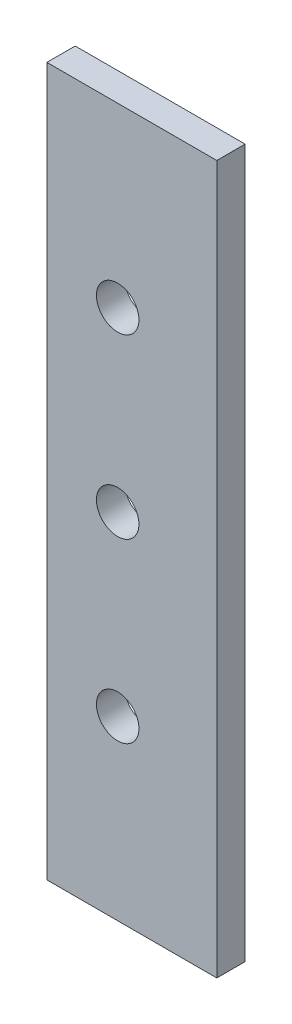
ISO-10303-21;
HEADER;
FILE_DESCRIPTION(('STEP AP214'),'2;1');
FILE_NAME('part.step','',(''),(''),'','','');
FILE_SCHEMA(('AUTOMOTIVE_DESIGN { 1 0 10303 214 1 1 1 1 }'));
ENDSEC;
DATA;
#1=APPLICATION_CONTEXT('core data for automotive mechanical design processes');
#2=APPLICATION_PROTOCOL_DEFINITION('international standard','automotive_design',2000,#1);
#3=PRODUCT_CONTEXT('',#1,'mechanical');
#4=PRODUCT('Part','Part','',(#3));
#5=PRODUCT_RELATED_PRODUCT_CATEGORY('part','',(#4));
#6=PRODUCT_DEFINITION_FORMATION('','',#4);
#7=PRODUCT_DEFINITION_CONTEXT('part definition',#1,'design');
#8=PRODUCT_DEFINITION('design','',#6,#7);
#9=PRODUCT_DEFINITION_SHAPE('','',#8);
#10=(LENGTH_UNIT() NAMED_UNIT(*) SI_UNIT(.MILLI.,.METRE.));
#11=(NAMED_UNIT(*) PLANE_ANGLE_UNIT() SI_UNIT($,.RADIAN.));
#12=(NAMED_UNIT(*) SI_UNIT($,.STERADIAN.) SOLID_ANGLE_UNIT());
#13=UNCERTAINTY_MEASURE_WITH_UNIT(LENGTH_MEASURE(1.E-05),#10,'distance_accuracy_value','');
#14=(GEOMETRIC_REPRESENTATION_CONTEXT(3) GLOBAL_UNCERTAINTY_ASSIGNED_CONTEXT((#13)) GLOBAL_UNIT_ASSIGNED_CONTEXT((#10,
#11,#12)) REPRESENTATION_CONTEXT('',''));
#15=CARTESIAN_POINT('',(0.,0.,0.));
#16=DIRECTION('',(0.,0.,1.));
#17=DIRECTION('',(1.,0.,0.));
#18=AXIS2_PLACEMENT_3D('',#15,#16,#17);
#19=CARTESIAN_POINT('',(-18.,75.,6.));
#20=DIRECTION('',(1.,0.,0.));
#21=DIRECTION('',(0.,1.,0.));
#22=AXIS2_PLACEMENT_3D('',#19,#20,#21);
#23=PLANE('',#22);
#24=DIRECTION('',(0.,-1.,0.));
#25=VECTOR('',#24,1.);
#26=CARTESIAN_POINT('',(-18.,75.,0.));
#27=LINE('',#26,#25);
#28=CARTESIAN_POINT('',(-18.,75.,0.));
#29=VERTEX_POINT('',#28);
#30=CARTESIAN_POINT('',(-18.,-75.,0.));
#31=VERTEX_POINT('',#30);
#32=EDGE_CURVE('E96',#29,#31,#27,.T.);
#33=ORIENTED_EDGE('',*,*,#32,.T.);
#34=DIRECTION('',(0.,0.,-1.));
#35=VECTOR('',#34,1.);
#36=CARTESIAN_POINT('',(-18.,-75.,6.));
#37=LINE('',#36,#35);
#38=CARTESIAN_POINT('',(-18.,-75.,6.));
#39=VERTEX_POINT('',#38);
#40=EDGE_CURVE('E11',#39,#31,#37,.T.);
#41=ORIENTED_EDGE('',*,*,#40,.F.);
#42=DIRECTION('',(0.,-1.,0.));
#43=VECTOR('',#42,1.);
#44=CARTESIAN_POINT('',(-18.,75.,6.));
#45=LINE('',#44,#43);
#46=CARTESIAN_POINT('',(-18.,75.,6.));
#47=VERTEX_POINT('',#46);
#48=EDGE_CURVE('E84',#47,#39,#45,.T.);
#49=ORIENTED_EDGE('',*,*,#48,.F.);
#50=DIRECTION('',(0.,0.,-1.));
#51=VECTOR('',#50,1.);
#52=CARTESIAN_POINT('',(-18.,75.,6.));
#53=LINE('',#52,#51);
#54=EDGE_CURVE('E92',#47,#29,#53,.T.);
#55=ORIENTED_EDGE('',*,*,#54,.T.);
#56=EDGE_LOOP('',(#33,#41,#49,#55));
#57=FACE_BOUND('',#56,.T.);
#58=ADVANCED_FACE('F33',(#57),#23,.F.);
#59=CARTESIAN_POINT('',(-18.,-75.,6.));
#60=DIRECTION('',(0.,1.,0.));
#61=DIRECTION('',(0.,0.,1.));
#62=AXIS2_PLACEMENT_3D('',#59,#60,#61);
#63=PLANE('',#62);
#64=DIRECTION('',(1.,0.,0.));
#65=VECTOR('',#64,1.);
#66=CARTESIAN_POINT('',(-18.,-75.,0.));
#67=LINE('',#66,#65);
#68=CARTESIAN_POINT('',(18.,-75.,0.));
#69=VERTEX_POINT('',#68);
#70=EDGE_CURVE('E88',#31,#69,#67,.T.);
#71=ORIENTED_EDGE('',*,*,#70,.T.);
#72=DIRECTION('',(0.,0.,-1.));
#73=VECTOR('',#72,1.);
#74=CARTESIAN_POINT('',(18.,-75.,6.));
#75=LINE('',#74,#73);
#76=CARTESIAN_POINT('',(18.,-75.,6.));
#77=VERTEX_POINT('',#76);
#78=EDGE_CURVE('E41',#77,#69,#75,.T.);
#79=ORIENTED_EDGE('',*,*,#78,.F.);
#80=DIRECTION('',(1.,0.,0.));
#81=VECTOR('',#80,1.);
#82=CARTESIAN_POINT('',(-18.,-75.,6.));
#83=LINE('',#82,#81);
#84=EDGE_CURVE('E79',#39,#77,#83,.T.);
#85=ORIENTED_EDGE('',*,*,#84,.F.);
#86=ORIENTED_EDGE('',*,*,#40,.T.);
#87=EDGE_LOOP('',(#71,#79,#85,#86));
#88=FACE_BOUND('',#87,.T.);
#89=ADVANCED_FACE('F87',(#88),#63,.F.);
#90=CARTESIAN_POINT('',(18.,75.,6.));
#91=DIRECTION('',(-1.,0.,0.));
#92=DIRECTION('',(0.,-1.,0.));
#93=AXIS2_PLACEMENT_3D('',#90,#91,#92);
#94=PLANE('',#93);
#95=DIRECTION('',(0.,1.,0.));
#96=VECTOR('',#95,1.);
#97=CARTESIAN_POINT('',(18.,75.,0.));
#98=LINE('',#97,#96);
#99=CARTESIAN_POINT('',(18.,75.,0.));
#100=VERTEX_POINT('',#99);
#101=EDGE_CURVE('E66',#69,#100,#98,.T.);
#102=ORIENTED_EDGE('',*,*,#101,.T.);
#103=DIRECTION('',(0.,0.,-1.));
#104=VECTOR('',#103,1.);
#105=CARTESIAN_POINT('',(18.,75.,6.));
#106=LINE('',#105,#104);
#107=CARTESIAN_POINT('',(18.,75.,6.));
#108=VERTEX_POINT('',#107);
#109=EDGE_CURVE('E89',#108,#100,#106,.T.);
#110=ORIENTED_EDGE('',*,*,#109,.F.);
#111=DIRECTION('',(0.,1.,0.));
#112=VECTOR('',#111,1.);
#113=CARTESIAN_POINT('',(18.,75.,6.));
#114=LINE('',#113,#112);
#115=EDGE_CURVE('E82',#77,#108,#114,.T.);
#116=ORIENTED_EDGE('',*,*,#115,.F.);
#117=ORIENTED_EDGE('',*,*,#78,.T.);
#118=EDGE_LOOP('',(#102,#110,#116,#117));
#119=FACE_BOUND('',#118,.T.);
#120=ADVANCED_FACE('F90',(#119),#94,.F.);
#121=CARTESIAN_POINT('',(-18.,75.,6.));
#122=DIRECTION('',(0.,-1.,0.));
#123=DIRECTION('',(0.,0.,-1.));
#124=AXIS2_PLACEMENT_3D('',#121,#122,#123);
#125=PLANE('',#124);
#126=DIRECTION('',(-1.,0.,0.));
#127=VECTOR('',#126,1.);
#128=CARTESIAN_POINT('',(-18.,75.,0.));
#129=LINE('',#128,#127);
#130=EDGE_CURVE('E72',#100,#29,#129,.T.);
#131=ORIENTED_EDGE('',*,*,#130,.T.);
#132=ORIENTED_EDGE('',*,*,#54,.F.);
#133=DIRECTION('',(-1.,0.,0.));
#134=VECTOR('',#133,1.);
#135=CARTESIAN_POINT('',(-18.,75.,6.));
#136=LINE('',#135,#134);
#137=EDGE_CURVE('E49',#108,#47,#136,.T.);
#138=ORIENTED_EDGE('',*,*,#137,.F.);
#139=ORIENTED_EDGE('',*,*,#109,.T.);
#140=EDGE_LOOP('',(#131,#132,#138,#139));
#141=FACE_BOUND('',#140,.T.);
#142=ADVANCED_FACE('F104',(#141),#125,.F.);
#143=CARTESIAN_POINT('',(0.,0.,6.));
#144=DIRECTION('',(0.,0.,1.));
#145=DIRECTION('',(1.,0.,0.));
#146=AXIS2_PLACEMENT_3D('',#143,#144,#145);
#147=PLANE('',#146);
#148=CARTESIAN_POINT('',(-3.00000000000001,37.5,6.));
#149=DIRECTION('',(0.,0.,1.));
#150=DIRECTION('',(1.,0.,0.));
#151=AXIS2_PLACEMENT_3D('',#148,#149,#150);
#152=CIRCLE('',#151,4.49999999999999);
#153=CARTESIAN_POINT('',(1.49999999999998,37.5,6.));
#154=VERTEX_POINT('',#153);
#155=EDGE_CURVE('E124',#154,#154,#152,.T.);
#156=ORIENTED_EDGE('',*,*,#155,.F.);
#157=EDGE_LOOP('',(#156));
#158=FACE_BOUND('',#157,.T.);
#159=CARTESIAN_POINT('',(-3.00000000000001,0.,6.));
#160=DIRECTION('',(0.,0.,1.));
#161=DIRECTION('',(1.,0.,0.));
#162=AXIS2_PLACEMENT_3D('',#159,#160,#161);
#163=CIRCLE('',#162,4.49999999999999);
#164=CARTESIAN_POINT('',(1.49999999999998,0.,6.));
#165=VERTEX_POINT('',#164);
#166=EDGE_CURVE('E118',#165,#165,#163,.T.);
#167=ORIENTED_EDGE('',*,*,#166,.F.);
#168=EDGE_LOOP('',(#167));
#169=FACE_BOUND('',#168,.T.);
#170=CARTESIAN_POINT('',(-3.00000000000001,-37.5,6.));
#171=DIRECTION('',(0.,0.,1.));
#172=DIRECTION('',(1.,0.,0.));
#173=AXIS2_PLACEMENT_3D('',#170,#171,#172);
#174=CIRCLE('',#173,4.49999999999999);
#175=CARTESIAN_POINT('',(1.49999999999998,-37.5,6.));
#176=VERTEX_POINT('',#175);
#177=EDGE_CURVE('E112',#176,#176,#174,.T.);
#178=ORIENTED_EDGE('',*,*,#177,.F.);
#179=EDGE_LOOP('',(#178));
#180=FACE_BOUND('',#179,.T.);
#181=ORIENTED_EDGE('',*,*,#48,.T.);
#182=ORIENTED_EDGE('',*,*,#84,.T.);
#183=ORIENTED_EDGE('',*,*,#115,.T.);
#184=ORIENTED_EDGE('',*,*,#137,.T.);
#185=EDGE_LOOP('',(#181,#182,#183,#184));
#186=FACE_BOUND('',#185,.T.);
#187=ADVANCED_FACE('F80',(#158,#169,#180,#186),#147,.T.);
#188=CARTESIAN_POINT('',(0.,0.,0.));
#189=DIRECTION('',(0.,0.,1.));
#190=DIRECTION('',(1.,0.,0.));
#191=AXIS2_PLACEMENT_3D('',#188,#189,#190);
#192=PLANE('',#191);
#193=CARTESIAN_POINT('',(-3.00000000000001,37.5,0.));
#194=DIRECTION('',(0.,0.,1.));
#195=DIRECTION('',(1.,0.,0.));
#196=AXIS2_PLACEMENT_3D('',#193,#194,#195);
#197=CIRCLE('',#196,4.5);
#198=CARTESIAN_POINT('',(1.49999999999999,37.5,0.));
#199=VERTEX_POINT('',#198);
#200=EDGE_CURVE('E121',#199,#199,#197,.T.);
#201=ORIENTED_EDGE('',*,*,#200,.T.);
#202=EDGE_LOOP('',(#201));
#203=FACE_BOUND('',#202,.T.);
#204=CARTESIAN_POINT('',(-3.00000000000001,0.,0.));
#205=DIRECTION('',(0.,0.,1.));
#206=DIRECTION('',(1.,0.,0.));
#207=AXIS2_PLACEMENT_3D('',#204,#205,#206);
#208=CIRCLE('',#207,4.5);
#209=CARTESIAN_POINT('',(1.49999999999999,0.,0.));
#210=VERTEX_POINT('',#209);
#211=EDGE_CURVE('E115',#210,#210,#208,.T.);
#212=ORIENTED_EDGE('',*,*,#211,.T.);
#213=EDGE_LOOP('',(#212));
#214=FACE_BOUND('',#213,.T.);
#215=CARTESIAN_POINT('',(-3.00000000000001,-37.5,0.));
#216=DIRECTION('',(0.,0.,1.));
#217=DIRECTION('',(1.,0.,0.));
#218=AXIS2_PLACEMENT_3D('',#215,#216,#217);
#219=CIRCLE('',#218,4.5);
#220=CARTESIAN_POINT('',(1.49999999999999,-37.5,0.));
#221=VERTEX_POINT('',#220);
#222=EDGE_CURVE('E99',#221,#221,#219,.T.);
#223=ORIENTED_EDGE('',*,*,#222,.T.);
#224=EDGE_LOOP('',(#223));
#225=FACE_BOUND('',#224,.T.);
#226=ORIENTED_EDGE('',*,*,#32,.F.);
#227=ORIENTED_EDGE('',*,*,#130,.F.);
#228=ORIENTED_EDGE('',*,*,#101,.F.);
#229=ORIENTED_EDGE('',*,*,#70,.F.);
#230=EDGE_LOOP('',(#226,#227,#228,#229));
#231=FACE_BOUND('',#230,.T.);
#232=ADVANCED_FACE('F107',(#203,#214,#225,#231),#192,.F.);
#233=CARTESIAN_POINT('',(-3.00000000000001,-37.5,6.));
#234=DIRECTION('',(0.,0.,1.));
#235=DIRECTION('',(1.,0.,0.));
#236=AXIS2_PLACEMENT_3D('',#233,#234,#235);
#237=CYLINDRICAL_SURFACE('',#236,4.49999999999999);
#238=ORIENTED_EDGE('',*,*,#222,.F.);
#239=EDGE_LOOP('',(#238));
#240=FACE_BOUND('',#239,.T.);
#241=ORIENTED_EDGE('',*,*,#177,.T.);
#242=EDGE_LOOP('',(#241));
#243=FACE_BOUND('',#242,.T.);
#244=ADVANCED_FACE('F137',(#240,#243),#237,.F.);
#245=CARTESIAN_POINT('',(-3.00000000000001,0.,6.));
#246=DIRECTION('',(0.,0.,1.));
#247=DIRECTION('',(1.,0.,0.));
#248=AXIS2_PLACEMENT_3D('',#245,#246,#247);
#249=CYLINDRICAL_SURFACE('',#248,4.49999999999999);
#250=ORIENTED_EDGE('',*,*,#211,.F.);
#251=EDGE_LOOP('',(#250));
#252=FACE_BOUND('',#251,.T.);
#253=ORIENTED_EDGE('',*,*,#166,.T.);
#254=EDGE_LOOP('',(#253));
#255=FACE_BOUND('',#254,.T.);
#256=ADVANCED_FACE('F139',(#252,#255),#249,.F.);
#257=CARTESIAN_POINT('',(-3.00000000000001,37.5,6.));
#258=DIRECTION('',(0.,0.,1.));
#259=DIRECTION('',(1.,0.,0.));
#260=AXIS2_PLACEMENT_3D('',#257,#258,#259);
#261=CYLINDRICAL_SURFACE('',#260,4.49999999999999);
#262=ORIENTED_EDGE('',*,*,#200,.F.);
#263=EDGE_LOOP('',(#262));
#264=FACE_BOUND('',#263,.T.);
#265=ORIENTED_EDGE('',*,*,#155,.T.);
#266=EDGE_LOOP('',(#265));
#267=FACE_BOUND('',#266,.T.);
#268=ADVANCED_FACE('F128',(#264,#267),#261,.F.);
#269=CLOSED_SHELL('',(#58,#89,#120,#142,#187,#232,#244,#256,#268));
#270=MANIFOLD_SOLID_BREP('B2',#269);
#271=ADVANCED_BREP_SHAPE_REPRESENTATION('',(#18,#270),#14);
#272=SHAPE_DEFINITION_REPRESENTATION(#9,#271);
ENDSEC;
END-ISO-10303-21;
